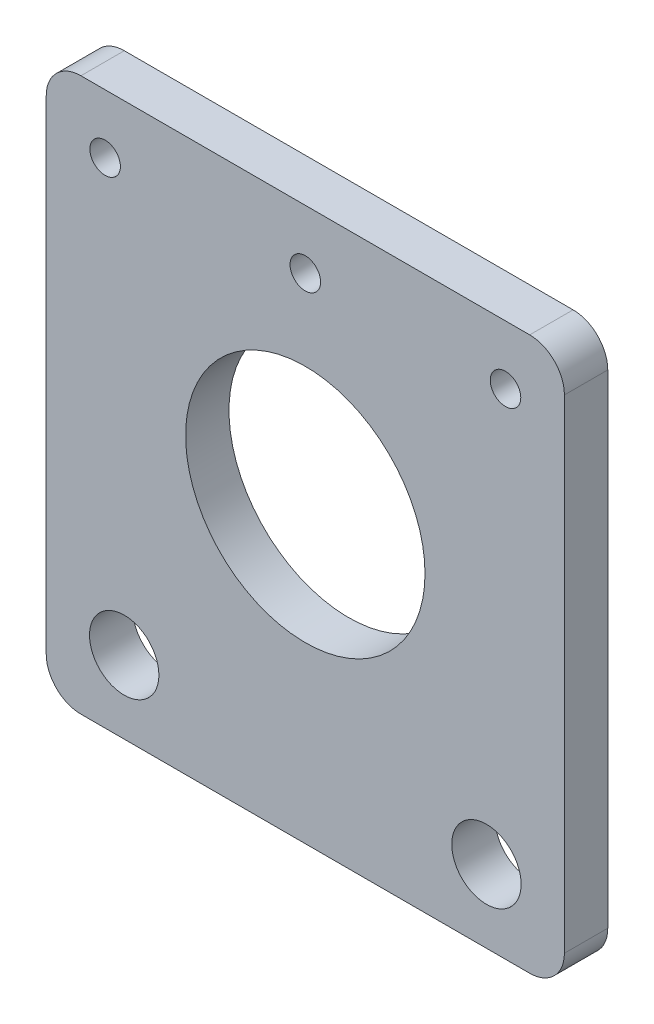
ISO-10303-21;
HEADER;
FILE_DESCRIPTION(('STEP AP214'),'2;1');
FILE_NAME('part.step','',(''),(''),'','','');
FILE_SCHEMA(('AUTOMOTIVE_DESIGN { 1 0 10303 214 1 1 1 1 }'));
ENDSEC;
DATA;
#1=APPLICATION_CONTEXT('core data for automotive mechanical design processes');
#2=APPLICATION_PROTOCOL_DEFINITION('international standard','automotive_design',2000,#1);
#3=PRODUCT_CONTEXT('',#1,'mechanical');
#4=PRODUCT('Part','Part','',(#3));
#5=PRODUCT_RELATED_PRODUCT_CATEGORY('part','',(#4));
#6=PRODUCT_DEFINITION_FORMATION('','',#4);
#7=PRODUCT_DEFINITION_CONTEXT('part definition',#1,'design');
#8=PRODUCT_DEFINITION('design','',#6,#7);
#9=PRODUCT_DEFINITION_SHAPE('','',#8);
#10=(LENGTH_UNIT() NAMED_UNIT(*) SI_UNIT(.MILLI.,.METRE.));
#11=(NAMED_UNIT(*) PLANE_ANGLE_UNIT() SI_UNIT($,.RADIAN.));
#12=(NAMED_UNIT(*) SI_UNIT($,.STERADIAN.) SOLID_ANGLE_UNIT());
#13=UNCERTAINTY_MEASURE_WITH_UNIT(LENGTH_MEASURE(1.E-05),#10,'distance_accuracy_value','');
#14=(GEOMETRIC_REPRESENTATION_CONTEXT(3) GLOBAL_UNCERTAINTY_ASSIGNED_CONTEXT((#13)) GLOBAL_UNIT_ASSIGNED_CONTEXT((#10,
#11,#12)) REPRESENTATION_CONTEXT('',''));
#15=CARTESIAN_POINT('',(0.,0.,0.));
#16=DIRECTION('',(0.,0.,1.));
#17=DIRECTION('',(1.,0.,0.));
#18=AXIS2_PLACEMENT_3D('',#15,#16,#17);
#19=CARTESIAN_POINT('',(0.,37.9349,3.175));
#20=DIRECTION('',(1.,0.,0.));
#21=DIRECTION('',(0.,0.,-1.));
#22=AXIS2_PLACEMENT_3D('',#19,#20,#21);
#23=PLANE('',#22);
#24=DIRECTION('',(0.,-1.,0.));
#25=VECTOR('',#24,1.);
#26=CARTESIAN_POINT('',(0.,37.9349,0.));
#27=LINE('',#26,#25);
#28=CARTESIAN_POINT('',(0.,35.3949,0.));
#29=VERTEX_POINT('',#28);
#30=CARTESIAN_POINT('',(0.,0.,0.));
#31=VERTEX_POINT('',#30);
#32=EDGE_CURVE('E168',#29,#31,#27,.T.);
#33=ORIENTED_EDGE('',*,*,#32,.T.);
#34=DIRECTION('',(0.,0.,-1.));
#35=VECTOR('',#34,1.);
#36=CARTESIAN_POINT('',(0.,0.,3.175));
#37=LINE('',#36,#35);
#38=CARTESIAN_POINT('',(0.,0.,3.175));
#39=VERTEX_POINT('',#38);
#40=EDGE_CURVE('E106',#31,#39,#37,.F.);
#41=ORIENTED_EDGE('',*,*,#40,.T.);
#42=DIRECTION('',(0.,-1.,0.));
#43=VECTOR('',#42,1.);
#44=CARTESIAN_POINT('',(0.,37.9349,3.175));
#45=LINE('',#44,#43);
#46=CARTESIAN_POINT('',(0.,35.3949,3.175));
#47=VERTEX_POINT('',#46);
#48=EDGE_CURVE('E169',#47,#39,#45,.T.);
#49=ORIENTED_EDGE('',*,*,#48,.F.);
#50=DIRECTION('',(0.,0.,-1.));
#51=VECTOR('',#50,1.);
#52=CARTESIAN_POINT('',(0.,35.3949,3.175));
#53=LINE('',#52,#51);
#54=EDGE_CURVE('E111',#47,#29,#53,.T.);
#55=ORIENTED_EDGE('',*,*,#54,.T.);
#56=EDGE_LOOP('',(#33,#41,#49,#55));
#57=FACE_BOUND('',#56,.T.);
#58=ADVANCED_FACE('F35',(#57),#23,.F.);
#59=CARTESIAN_POINT('',(37.9349,37.9349,3.175));
#60=DIRECTION('',(-1.,0.,0.));
#61=DIRECTION('',(0.,-1.,0.));
#62=AXIS2_PLACEMENT_3D('',#59,#60,#61);
#63=PLANE('',#62);
#64=DIRECTION('',(0.,1.,0.));
#65=VECTOR('',#64,1.);
#66=CARTESIAN_POINT('',(37.9349,37.9349,3.175));
#67=LINE('',#66,#65);
#68=CARTESIAN_POINT('',(37.9349,0.,3.175));
#69=VERTEX_POINT('',#68);
#70=CARTESIAN_POINT('',(37.9349,35.3949,3.175));
#71=VERTEX_POINT('',#70);
#72=EDGE_CURVE('E172',#69,#71,#67,.T.);
#73=ORIENTED_EDGE('',*,*,#72,.F.);
#74=DIRECTION('',(0.,0.,1.));
#75=VECTOR('',#74,1.);
#76=CARTESIAN_POINT('',(37.9349,0.,0.));
#77=LINE('',#76,#75);
#78=CARTESIAN_POINT('',(37.9349,0.,0.));
#79=VERTEX_POINT('',#78);
#80=EDGE_CURVE('E199',#69,#79,#77,.F.);
#81=ORIENTED_EDGE('',*,*,#80,.T.);
#82=DIRECTION('',(0.,1.,0.));
#83=VECTOR('',#82,1.);
#84=CARTESIAN_POINT('',(37.9349,37.9349,0.));
#85=LINE('',#84,#83);
#86=CARTESIAN_POINT('',(37.9349,35.3949,0.));
#87=VERTEX_POINT('',#86);
#88=EDGE_CURVE('E178',#79,#87,#85,.T.);
#89=ORIENTED_EDGE('',*,*,#88,.T.);
#90=DIRECTION('',(0.,0.,-1.));
#91=VECTOR('',#90,1.);
#92=CARTESIAN_POINT('',(37.9349,35.3949,3.175));
#93=LINE('',#92,#91);
#94=EDGE_CURVE('E197',#87,#71,#93,.F.);
#95=ORIENTED_EDGE('',*,*,#94,.T.);
#96=EDGE_LOOP('',(#73,#81,#89,#95));
#97=FACE_BOUND('',#96,.T.);
#98=ADVANCED_FACE('F203',(#97),#63,.F.);
#99=CARTESIAN_POINT('',(0.,37.9349,3.175));
#100=DIRECTION('',(0.,-1.,0.));
#101=DIRECTION('',(0.,0.,-1.));
#102=AXIS2_PLACEMENT_3D('',#99,#100,#101);
#103=PLANE('',#102);
#104=DIRECTION('',(-1.,0.,0.));
#105=VECTOR('',#104,1.);
#106=CARTESIAN_POINT('',(0.,37.9349,3.175));
#107=LINE('',#106,#105);
#108=CARTESIAN_POINT('',(35.3949,37.9349,3.175));
#109=VERTEX_POINT('',#108);
#110=CARTESIAN_POINT('',(2.54,37.9349,3.175));
#111=VERTEX_POINT('',#110);
#112=EDGE_CURVE('E175',#109,#111,#107,.T.);
#113=ORIENTED_EDGE('',*,*,#112,.F.);
#114=DIRECTION('',(0.,0.,-1.));
#115=VECTOR('',#114,1.);
#116=CARTESIAN_POINT('',(35.3949,37.9349,3.175));
#117=LINE('',#116,#115);
#118=CARTESIAN_POINT('',(35.3949,37.9349,0.));
#119=VERTEX_POINT('',#118);
#120=EDGE_CURVE('E11',#109,#119,#117,.T.);
#121=ORIENTED_EDGE('',*,*,#120,.T.);
#122=DIRECTION('',(-1.,0.,0.));
#123=VECTOR('',#122,1.);
#124=CARTESIAN_POINT('',(0.,37.9349,0.));
#125=LINE('',#124,#123);
#126=CARTESIAN_POINT('',(2.54,37.9349,0.));
#127=VERTEX_POINT('',#126);
#128=EDGE_CURVE('E173',#119,#127,#125,.T.);
#129=ORIENTED_EDGE('',*,*,#128,.T.);
#130=DIRECTION('',(0.,0.,-1.));
#131=VECTOR('',#130,1.);
#132=CARTESIAN_POINT('',(2.54,37.9349,3.175));
#133=LINE('',#132,#131);
#134=EDGE_CURVE('E43',#127,#111,#133,.F.);
#135=ORIENTED_EDGE('',*,*,#134,.T.);
#136=EDGE_LOOP('',(#113,#121,#129,#135));
#137=FACE_BOUND('',#136,.T.);
#138=ADVANCED_FACE('F214',(#137),#103,.F.);
#139=CARTESIAN_POINT('',(0.,0.,3.175));
#140=DIRECTION('',(0.,0.,1.));
#141=DIRECTION('',(1.,0.,0.));
#142=AXIS2_PLACEMENT_3D('',#139,#140,#141);
#143=PLANE('',#142);
#144=CARTESIAN_POINT('',(18.96745,18.96745,3.175));
#145=DIRECTION('',(0.,0.,1.));
#146=DIRECTION('',(1.,0.,0.));
#147=AXIS2_PLACEMENT_3D('',#144,#145,#146);
#148=CIRCLE('',#147,8.76299999999999);
#149=CARTESIAN_POINT('',(27.73045,18.96745,3.175));
#150=VERTEX_POINT('',#149);
#151=EDGE_CURVE('E130',#150,#150,#148,.T.);
#152=ORIENTED_EDGE('',*,*,#151,.F.);
#153=EDGE_LOOP('',(#152));
#154=FACE_BOUND('',#153,.T.);
#155=CARTESIAN_POINT('',(18.96745,33.62325,3.175));
#156=DIRECTION('',(0.,0.,1.));
#157=DIRECTION('',(1.,0.,0.));
#158=AXIS2_PLACEMENT_3D('',#155,#156,#157);
#159=CIRCLE('',#158,1.1176);
#160=CARTESIAN_POINT('',(20.08505,33.62325,3.175));
#161=VERTEX_POINT('',#160);
#162=EDGE_CURVE('E138',#161,#161,#159,.T.);
#163=ORIENTED_EDGE('',*,*,#162,.F.);
#164=EDGE_LOOP('',(#163));
#165=FACE_BOUND('',#164,.T.);
#166=CARTESIAN_POINT('',(32.22625,2.78765,3.175));
#167=DIRECTION('',(0.,0.,1.));
#168=DIRECTION('',(1.,0.,0.));
#169=AXIS2_PLACEMENT_3D('',#166,#167,#168);
#170=CIRCLE('',#169,2.54);
#171=CARTESIAN_POINT('',(34.76625,2.78765,3.175));
#172=VERTEX_POINT('',#171);
#173=EDGE_CURVE('E144',#172,#172,#170,.T.);
#174=ORIENTED_EDGE('',*,*,#173,.F.);
#175=EDGE_LOOP('',(#174));
#176=FACE_BOUND('',#175,.T.);
#177=CARTESIAN_POINT('',(5.70865,2.78764999999999,3.175));
#178=DIRECTION('',(0.,0.,1.));
#179=DIRECTION('',(1.,0.,0.));
#180=AXIS2_PLACEMENT_3D('',#177,#178,#179);
#181=CIRCLE('',#180,2.54);
#182=CARTESIAN_POINT('',(8.24865,2.78764999999999,3.175));
#183=VERTEX_POINT('',#182);
#184=EDGE_CURVE('E150',#183,#183,#181,.T.);
#185=ORIENTED_EDGE('',*,*,#184,.F.);
#186=EDGE_LOOP('',(#185));
#187=FACE_BOUND('',#186,.T.);
#188=CARTESIAN_POINT('',(4.31165,33.62325,3.175));
#189=DIRECTION('',(0.,0.,1.));
#190=DIRECTION('',(1.,0.,0.));
#191=AXIS2_PLACEMENT_3D('',#188,#189,#190);
#192=CIRCLE('',#191,1.1176);
#193=CARTESIAN_POINT('',(5.42925000000001,33.62325,3.175));
#194=VERTEX_POINT('',#193);
#195=EDGE_CURVE('E156',#194,#194,#192,.T.);
#196=ORIENTED_EDGE('',*,*,#195,.F.);
#197=EDGE_LOOP('',(#196));
#198=FACE_BOUND('',#197,.T.);
#199=CARTESIAN_POINT('',(33.62325,33.62325,3.175));
#200=DIRECTION('',(0.,0.,1.));
#201=DIRECTION('',(1.,0.,0.));
#202=AXIS2_PLACEMENT_3D('',#199,#200,#201);
#203=CIRCLE('',#202,1.11759999999999);
#204=CARTESIAN_POINT('',(34.74085,33.62325,3.175));
#205=VERTEX_POINT('',#204);
#206=EDGE_CURVE('E162',#205,#205,#203,.T.);
#207=ORIENTED_EDGE('',*,*,#206,.F.);
#208=EDGE_LOOP('',(#207));
#209=FACE_BOUND('',#208,.T.);
#210=ORIENTED_EDGE('',*,*,#48,.T.);
#211=CARTESIAN_POINT('',(2.54,0.,3.175));
#212=DIRECTION('',(0.,0.,1.));
#213=DIRECTION('',(1.,0.,0.));
#214=AXIS2_PLACEMENT_3D('',#211,#212,#213);
#215=CIRCLE('',#214,2.54);
#216=CARTESIAN_POINT('',(2.54,-2.54,3.175));
#217=VERTEX_POINT('',#216);
#218=EDGE_CURVE('E195',#39,#217,#215,.T.);
#219=ORIENTED_EDGE('',*,*,#218,.T.);
#220=DIRECTION('',(-1.,0.,0.));
#221=VECTOR('',#220,1.);
#222=CARTESIAN_POINT('',(0.,-2.54,3.175));
#223=LINE('',#222,#221);
#224=CARTESIAN_POINT('',(35.3949,-2.53999999999999,3.175));
#225=VERTEX_POINT('',#224);
#226=EDGE_CURVE('E122',#225,#217,#223,.T.);
#227=ORIENTED_EDGE('',*,*,#226,.F.);
#228=CARTESIAN_POINT('',(35.3949,0.,3.175));
#229=DIRECTION('',(0.,0.,1.));
#230=DIRECTION('',(1.,0.,0.));
#231=AXIS2_PLACEMENT_3D('',#228,#229,#230);
#232=CIRCLE('',#231,2.54);
#233=EDGE_CURVE('E193',#225,#69,#232,.T.);
#234=ORIENTED_EDGE('',*,*,#233,.T.);
#235=ORIENTED_EDGE('',*,*,#72,.T.);
#236=CARTESIAN_POINT('',(35.3949,35.3949,3.175));
#237=DIRECTION('',(0.,0.,1.));
#238=DIRECTION('',(1.,0.,0.));
#239=AXIS2_PLACEMENT_3D('',#236,#237,#238);
#240=CIRCLE('',#239,2.54);
#241=EDGE_CURVE('E56',#71,#109,#240,.T.);
#242=ORIENTED_EDGE('',*,*,#241,.T.);
#243=ORIENTED_EDGE('',*,*,#112,.T.);
#244=CARTESIAN_POINT('',(2.54,35.3949,3.175));
#245=DIRECTION('',(0.,0.,1.));
#246=DIRECTION('',(1.,0.,0.));
#247=AXIS2_PLACEMENT_3D('',#244,#245,#246);
#248=CIRCLE('',#247,2.54);
#249=EDGE_CURVE('E190',#111,#47,#248,.T.);
#250=ORIENTED_EDGE('',*,*,#249,.T.);
#251=EDGE_LOOP('',(#210,#219,#227,#234,#235,#242,#243,#250));
#252=FACE_BOUND('',#251,.T.);
#253=ADVANCED_FACE('F208',(#154,#165,#176,#187,#198,#209,#252),#143,.T.);
#254=CARTESIAN_POINT('',(0.,0.,0.));
#255=DIRECTION('',(0.,0.,1.));
#256=DIRECTION('',(1.,0.,0.));
#257=AXIS2_PLACEMENT_3D('',#254,#255,#256);
#258=PLANE('',#257);
#259=CARTESIAN_POINT('',(18.96745,18.96745,0.));
#260=DIRECTION('',(0.,0.,1.));
#261=DIRECTION('',(1.,0.,0.));
#262=AXIS2_PLACEMENT_3D('',#259,#260,#261);
#263=CIRCLE('',#262,8.76299999999999);
#264=CARTESIAN_POINT('',(27.73045,18.96745,0.));
#265=VERTEX_POINT('',#264);
#266=EDGE_CURVE('E135',#265,#265,#263,.F.);
#267=ORIENTED_EDGE('',*,*,#266,.F.);
#268=EDGE_LOOP('',(#267));
#269=FACE_BOUND('',#268,.T.);
#270=CARTESIAN_POINT('',(18.96745,33.62325,0.));
#271=DIRECTION('',(0.,0.,1.));
#272=DIRECTION('',(1.,0.,0.));
#273=AXIS2_PLACEMENT_3D('',#270,#271,#272);
#274=CIRCLE('',#273,1.1176);
#275=CARTESIAN_POINT('',(20.08505,33.62325,0.));
#276=VERTEX_POINT('',#275);
#277=EDGE_CURVE('E141',#276,#276,#274,.F.);
#278=ORIENTED_EDGE('',*,*,#277,.F.);
#279=EDGE_LOOP('',(#278));
#280=FACE_BOUND('',#279,.T.);
#281=CARTESIAN_POINT('',(32.22625,2.78765,0.));
#282=DIRECTION('',(0.,0.,1.));
#283=DIRECTION('',(1.,0.,0.));
#284=AXIS2_PLACEMENT_3D('',#281,#282,#283);
#285=CIRCLE('',#284,2.54);
#286=CARTESIAN_POINT('',(34.76625,2.78765,0.));
#287=VERTEX_POINT('',#286);
#288=EDGE_CURVE('E147',#287,#287,#285,.F.);
#289=ORIENTED_EDGE('',*,*,#288,.F.);
#290=EDGE_LOOP('',(#289));
#291=FACE_BOUND('',#290,.T.);
#292=CARTESIAN_POINT('',(5.70865,2.78764999999999,0.));
#293=DIRECTION('',(0.,0.,1.));
#294=DIRECTION('',(1.,0.,0.));
#295=AXIS2_PLACEMENT_3D('',#292,#293,#294);
#296=CIRCLE('',#295,2.54);
#297=CARTESIAN_POINT('',(8.24865,2.78764999999999,0.));
#298=VERTEX_POINT('',#297);
#299=EDGE_CURVE('E153',#298,#298,#296,.F.);
#300=ORIENTED_EDGE('',*,*,#299,.F.);
#301=EDGE_LOOP('',(#300));
#302=FACE_BOUND('',#301,.T.);
#303=CARTESIAN_POINT('',(4.31165,33.62325,0.));
#304=DIRECTION('',(0.,0.,1.));
#305=DIRECTION('',(1.,0.,0.));
#306=AXIS2_PLACEMENT_3D('',#303,#304,#305);
#307=CIRCLE('',#306,1.1176);
#308=CARTESIAN_POINT('',(5.42925000000001,33.62325,0.));
#309=VERTEX_POINT('',#308);
#310=EDGE_CURVE('E159',#309,#309,#307,.F.);
#311=ORIENTED_EDGE('',*,*,#310,.F.);
#312=EDGE_LOOP('',(#311));
#313=FACE_BOUND('',#312,.T.);
#314=CARTESIAN_POINT('',(33.62325,33.62325,0.));
#315=DIRECTION('',(0.,0.,1.));
#316=DIRECTION('',(1.,0.,0.));
#317=AXIS2_PLACEMENT_3D('',#314,#315,#316);
#318=CIRCLE('',#317,1.11759999999999);
#319=CARTESIAN_POINT('',(34.74085,33.62325,0.));
#320=VERTEX_POINT('',#319);
#321=EDGE_CURVE('E165',#320,#320,#318,.F.);
#322=ORIENTED_EDGE('',*,*,#321,.F.);
#323=EDGE_LOOP('',(#322));
#324=FACE_BOUND('',#323,.T.);
#325=DIRECTION('',(1.,0.,0.));
#326=VECTOR('',#325,1.);
#327=CARTESIAN_POINT('',(0.,-2.54,0.));
#328=LINE('',#327,#326);
#329=CARTESIAN_POINT('',(2.54,-2.54,0.));
#330=VERTEX_POINT('',#329);
#331=CARTESIAN_POINT('',(35.3949,-2.53999999999999,0.));
#332=VERTEX_POINT('',#331);
#333=EDGE_CURVE('E119',#330,#332,#328,.T.);
#334=ORIENTED_EDGE('',*,*,#333,.F.);
#335=CARTESIAN_POINT('',(2.54,0.,0.));
#336=DIRECTION('',(0.,0.,1.));
#337=DIRECTION('',(1.,0.,0.));
#338=AXIS2_PLACEMENT_3D('',#335,#336,#337);
#339=CIRCLE('',#338,2.54);
#340=EDGE_CURVE('E101',#330,#31,#339,.F.);
#341=ORIENTED_EDGE('',*,*,#340,.T.);
#342=ORIENTED_EDGE('',*,*,#32,.F.);
#343=CARTESIAN_POINT('',(2.54,35.3949,0.));
#344=DIRECTION('',(0.,0.,1.));
#345=DIRECTION('',(1.,0.,0.));
#346=AXIS2_PLACEMENT_3D('',#343,#344,#345);
#347=CIRCLE('',#346,2.54);
#348=EDGE_CURVE('E123',#29,#127,#347,.F.);
#349=ORIENTED_EDGE('',*,*,#348,.T.);
#350=ORIENTED_EDGE('',*,*,#128,.F.);
#351=CARTESIAN_POINT('',(35.3949,35.3949,0.));
#352=DIRECTION('',(0.,0.,1.));
#353=DIRECTION('',(1.,0.,0.));
#354=AXIS2_PLACEMENT_3D('',#351,#352,#353);
#355=CIRCLE('',#354,2.54);
#356=EDGE_CURVE('E184',#119,#87,#355,.F.);
#357=ORIENTED_EDGE('',*,*,#356,.T.);
#358=ORIENTED_EDGE('',*,*,#88,.F.);
#359=CARTESIAN_POINT('',(35.3949,0.,0.));
#360=DIRECTION('',(0.,0.,1.));
#361=DIRECTION('',(1.,0.,0.));
#362=AXIS2_PLACEMENT_3D('',#359,#360,#361);
#363=CIRCLE('',#362,2.54);
#364=EDGE_CURVE('E112',#79,#332,#363,.F.);
#365=ORIENTED_EDGE('',*,*,#364,.T.);
#366=EDGE_LOOP('',(#334,#341,#342,#349,#350,#357,#358,#365));
#367=FACE_BOUND('',#366,.T.);
#368=ADVANCED_FACE('F126',(#269,#280,#291,#302,#313,#324,#367),#258,.F.);
#369=CARTESIAN_POINT('',(33.62325,33.62325,-24.7855068941509));
#370=DIRECTION('',(0.,0.,1.));
#371=DIRECTION('',(1.,0.,0.));
#372=AXIS2_PLACEMENT_3D('',#369,#370,#371);
#373=CYLINDRICAL_SURFACE('',#372,1.11759999999999);
#374=ORIENTED_EDGE('',*,*,#321,.T.);
#375=EDGE_LOOP('',(#374));
#376=FACE_BOUND('',#375,.T.);
#377=ORIENTED_EDGE('',*,*,#206,.T.);
#378=EDGE_LOOP('',(#377));
#379=FACE_BOUND('',#378,.T.);
#380=ADVANCED_FACE('F259',(#376,#379),#373,.F.);
#381=CARTESIAN_POINT('',(4.31165,33.62325,-24.7855068941509));
#382=DIRECTION('',(0.,0.,1.));
#383=DIRECTION('',(1.,0.,0.));
#384=AXIS2_PLACEMENT_3D('',#381,#382,#383);
#385=CYLINDRICAL_SURFACE('',#384,1.1176);
#386=ORIENTED_EDGE('',*,*,#310,.T.);
#387=EDGE_LOOP('',(#386));
#388=FACE_BOUND('',#387,.T.);
#389=ORIENTED_EDGE('',*,*,#195,.T.);
#390=EDGE_LOOP('',(#389));
#391=FACE_BOUND('',#390,.T.);
#392=ADVANCED_FACE('F255',(#388,#391),#385,.F.);
#393=CARTESIAN_POINT('',(5.70865,2.78764999999999,-24.7855068941509));
#394=DIRECTION('',(0.,0.,1.));
#395=DIRECTION('',(1.,0.,0.));
#396=AXIS2_PLACEMENT_3D('',#393,#394,#395);
#397=CYLINDRICAL_SURFACE('',#396,2.54);
#398=ORIENTED_EDGE('',*,*,#299,.T.);
#399=EDGE_LOOP('',(#398));
#400=FACE_BOUND('',#399,.T.);
#401=ORIENTED_EDGE('',*,*,#184,.T.);
#402=EDGE_LOOP('',(#401));
#403=FACE_BOUND('',#402,.T.);
#404=ADVANCED_FACE('F251',(#400,#403),#397,.F.);
#405=CARTESIAN_POINT('',(32.22625,2.78765,-24.7855068941509));
#406=DIRECTION('',(0.,0.,1.));
#407=DIRECTION('',(1.,0.,0.));
#408=AXIS2_PLACEMENT_3D('',#405,#406,#407);
#409=CYLINDRICAL_SURFACE('',#408,2.54);
#410=ORIENTED_EDGE('',*,*,#288,.T.);
#411=EDGE_LOOP('',(#410));
#412=FACE_BOUND('',#411,.T.);
#413=ORIENTED_EDGE('',*,*,#173,.T.);
#414=EDGE_LOOP('',(#413));
#415=FACE_BOUND('',#414,.T.);
#416=ADVANCED_FACE('F247',(#412,#415),#409,.F.);
#417=CARTESIAN_POINT('',(18.96745,33.62325,-24.7855068941509));
#418=DIRECTION('',(0.,0.,1.));
#419=DIRECTION('',(1.,0.,0.));
#420=AXIS2_PLACEMENT_3D('',#417,#418,#419);
#421=CYLINDRICAL_SURFACE('',#420,1.1176);
#422=ORIENTED_EDGE('',*,*,#277,.T.);
#423=EDGE_LOOP('',(#422));
#424=FACE_BOUND('',#423,.T.);
#425=ORIENTED_EDGE('',*,*,#162,.T.);
#426=EDGE_LOOP('',(#425));
#427=FACE_BOUND('',#426,.T.);
#428=ADVANCED_FACE('F241',(#424,#427),#421,.F.);
#429=CARTESIAN_POINT('',(18.96745,18.96745,-24.7855068941509));
#430=DIRECTION('',(0.,0.,1.));
#431=DIRECTION('',(1.,0.,0.));
#432=AXIS2_PLACEMENT_3D('',#429,#430,#431);
#433=CYLINDRICAL_SURFACE('',#432,8.76299999999999);
#434=ORIENTED_EDGE('',*,*,#266,.T.);
#435=EDGE_LOOP('',(#434));
#436=FACE_BOUND('',#435,.T.);
#437=ORIENTED_EDGE('',*,*,#151,.T.);
#438=EDGE_LOOP('',(#437));
#439=FACE_BOUND('',#438,.T.);
#440=ADVANCED_FACE('F236',(#436,#439),#433,.F.);
#441=CARTESIAN_POINT('',(0.,-2.54,0.));
#442=DIRECTION('',(0.,-1.,0.));
#443=DIRECTION('',(1.,0.,0.));
#444=AXIS2_PLACEMENT_3D('',#441,#442,#443);
#445=PLANE('',#444);
#446=ORIENTED_EDGE('',*,*,#226,.T.);
#447=DIRECTION('',(0.,0.,-1.));
#448=VECTOR('',#447,1.);
#449=CARTESIAN_POINT('',(2.54,-2.54,0.));
#450=LINE('',#449,#448);
#451=EDGE_CURVE('E105',#217,#330,#450,.T.);
#452=ORIENTED_EDGE('',*,*,#451,.T.);
#453=ORIENTED_EDGE('',*,*,#333,.T.);
#454=DIRECTION('',(0.,0.,1.));
#455=VECTOR('',#454,1.);
#456=CARTESIAN_POINT('',(35.3949,-2.53999999999999,3.175));
#457=LINE('',#456,#455);
#458=EDGE_CURVE('E124',#332,#225,#457,.T.);
#459=ORIENTED_EDGE('',*,*,#458,.T.);
#460=EDGE_LOOP('',(#446,#452,#453,#459));
#461=FACE_BOUND('',#460,.T.);
#462=ADVANCED_FACE('F117',(#461),#445,.T.);
#463=CARTESIAN_POINT('',(2.54,0.,0.));
#464=DIRECTION('',(0.,0.,1.));
#465=DIRECTION('',(1.,0.,0.));
#466=AXIS2_PLACEMENT_3D('',#463,#464,#465);
#467=CYLINDRICAL_SURFACE('',#466,2.54);
#468=ORIENTED_EDGE('',*,*,#218,.F.);
#469=ORIENTED_EDGE('',*,*,#40,.F.);
#470=ORIENTED_EDGE('',*,*,#340,.F.);
#471=ORIENTED_EDGE('',*,*,#451,.F.);
#472=EDGE_LOOP('',(#468,#469,#470,#471));
#473=FACE_BOUND('',#472,.T.);
#474=ADVANCED_FACE('F104',(#473),#467,.T.);
#475=CARTESIAN_POINT('',(35.3949,0.,0.));
#476=DIRECTION('',(0.,0.,-1.));
#477=DIRECTION('',(-1.,0.,0.));
#478=AXIS2_PLACEMENT_3D('',#475,#476,#477);
#479=CYLINDRICAL_SURFACE('',#478,2.54);
#480=ORIENTED_EDGE('',*,*,#364,.F.);
#481=ORIENTED_EDGE('',*,*,#80,.F.);
#482=ORIENTED_EDGE('',*,*,#233,.F.);
#483=ORIENTED_EDGE('',*,*,#458,.F.);
#484=EDGE_LOOP('',(#480,#481,#482,#483));
#485=FACE_BOUND('',#484,.T.);
#486=ADVANCED_FACE('F207',(#485),#479,.T.);
#487=CARTESIAN_POINT('',(35.3949,35.3949,3.175));
#488=DIRECTION('',(0.,0.,-1.));
#489=DIRECTION('',(-1.,0.,0.));
#490=AXIS2_PLACEMENT_3D('',#487,#488,#489);
#491=CYLINDRICAL_SURFACE('',#490,2.54);
#492=ORIENTED_EDGE('',*,*,#241,.F.);
#493=ORIENTED_EDGE('',*,*,#94,.F.);
#494=ORIENTED_EDGE('',*,*,#356,.F.);
#495=ORIENTED_EDGE('',*,*,#120,.F.);
#496=EDGE_LOOP('',(#492,#493,#494,#495));
#497=FACE_BOUND('',#496,.T.);
#498=ADVANCED_FACE('F217',(#497),#491,.T.);
#499=CARTESIAN_POINT('',(2.54,35.3949,3.175));
#500=DIRECTION('',(0.,0.,-1.));
#501=DIRECTION('',(-1.,0.,0.));
#502=AXIS2_PLACEMENT_3D('',#499,#500,#501);
#503=CYLINDRICAL_SURFACE('',#502,2.54);
#504=ORIENTED_EDGE('',*,*,#249,.F.);
#505=ORIENTED_EDGE('',*,*,#134,.F.);
#506=ORIENTED_EDGE('',*,*,#348,.F.);
#507=ORIENTED_EDGE('',*,*,#54,.F.);
#508=EDGE_LOOP('',(#504,#505,#506,#507));
#509=FACE_BOUND('',#508,.T.);
#510=ADVANCED_FACE('F37',(#509),#503,.T.);
#511=CLOSED_SHELL('',(#58,#98,#138,#253,#368,#380,#392,#404,#416,#428,#440,#462,#474,#486,#498,#510));
#512=MANIFOLD_SOLID_BREP('B2',#511);
#513=ADVANCED_BREP_SHAPE_REPRESENTATION('',(#18,#512),#14);
#514=SHAPE_DEFINITION_REPRESENTATION(#9,#513);
ENDSEC;
END-ISO-10303-21;
